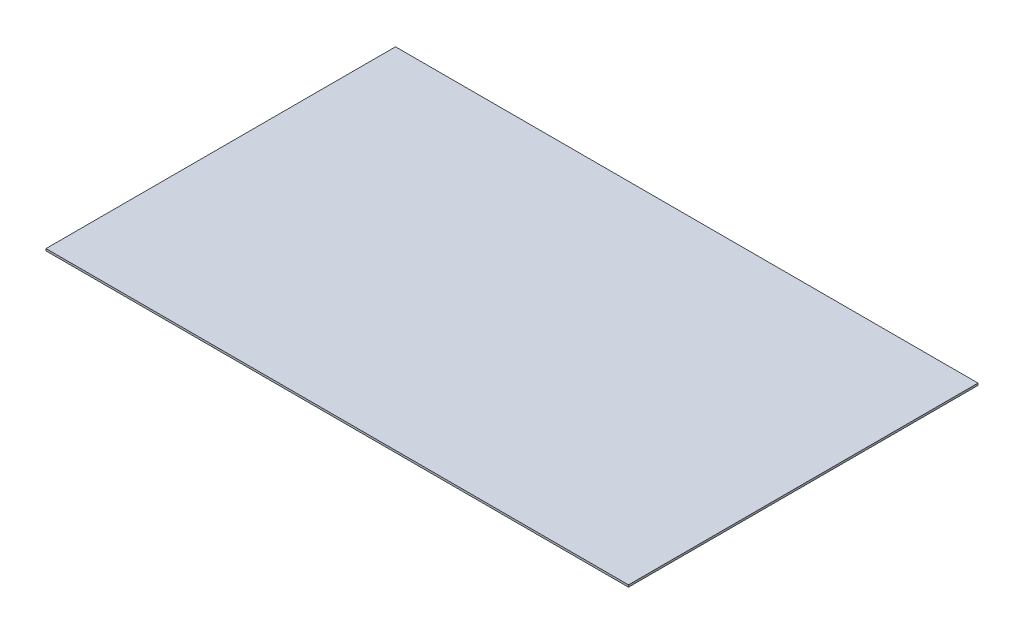
ISO-10303-21;
HEADER;
FILE_DESCRIPTION(('STEP AP214'),'2;1');
FILE_NAME('part.step','',(''),(''),'','','');
FILE_SCHEMA(('AUTOMOTIVE_DESIGN { 1 0 10303 214 1 1 1 1 }'));
ENDSEC;
DATA;
#1=APPLICATION_CONTEXT('core data for automotive mechanical design processes');
#2=APPLICATION_PROTOCOL_DEFINITION('international standard','automotive_design',2000,#1);
#3=PRODUCT_CONTEXT('',#1,'mechanical');
#4=PRODUCT('Part','Part','',(#3));
#5=PRODUCT_RELATED_PRODUCT_CATEGORY('part','',(#4));
#6=PRODUCT_DEFINITION_FORMATION('','',#4);
#7=PRODUCT_DEFINITION_CONTEXT('part definition',#1,'design');
#8=PRODUCT_DEFINITION('design','',#6,#7);
#9=PRODUCT_DEFINITION_SHAPE('','',#8);
#10=(LENGTH_UNIT() NAMED_UNIT(*) SI_UNIT(.MILLI.,.METRE.));
#11=(NAMED_UNIT(*) PLANE_ANGLE_UNIT() SI_UNIT($,.RADIAN.));
#12=(NAMED_UNIT(*) SI_UNIT($,.STERADIAN.) SOLID_ANGLE_UNIT());
#13=UNCERTAINTY_MEASURE_WITH_UNIT(LENGTH_MEASURE(1.E-05),#10,'distance_accuracy_value','');
#14=(GEOMETRIC_REPRESENTATION_CONTEXT(3) GLOBAL_UNCERTAINTY_ASSIGNED_CONTEXT((#13)) GLOBAL_UNIT_ASSIGNED_CONTEXT((#10,
#11,#12)) REPRESENTATION_CONTEXT('',''));
#15=CARTESIAN_POINT('',(0.,0.,0.));
#16=DIRECTION('',(0.,0.,1.));
#17=DIRECTION('',(1.,0.,0.));
#18=AXIS2_PLACEMENT_3D('',#15,#16,#17);
#19=CARTESIAN_POINT('',(0.,-0.889,0.));
#20=DIRECTION('',(-1.,0.,0.));
#21=DIRECTION('',(0.,0.,1.));
#22=AXIS2_PLACEMENT_3D('',#19,#20,#21);
#23=PLANE('',#22);
#24=DIRECTION('',(0.,0.,1.));
#25=VECTOR('',#24,1.);
#26=CARTESIAN_POINT('',(0.,0.,0.));
#27=LINE('',#26,#25);
#28=CARTESIAN_POINT('',(0.,0.,-152.4));
#29=VERTEX_POINT('',#28);
#30=CARTESIAN_POINT('',(0.,0.,0.));
#31=VERTEX_POINT('',#30);
#32=EDGE_CURVE('E97',#29,#31,#27,.T.);
#33=ORIENTED_EDGE('',*,*,#32,.F.);
#34=DIRECTION('',(0.,1.,0.));
#35=VECTOR('',#34,1.);
#36=CARTESIAN_POINT('',(0.,-0.889,-152.4));
#37=LINE('',#36,#35);
#38=CARTESIAN_POINT('',(0.,-0.889,-152.4));
#39=VERTEX_POINT('',#38);
#40=EDGE_CURVE('E11',#39,#29,#37,.T.);
#41=ORIENTED_EDGE('',*,*,#40,.F.);
#42=DIRECTION('',(0.,0.,1.));
#43=VECTOR('',#42,1.);
#44=CARTESIAN_POINT('',(0.,-0.889,0.));
#45=LINE('',#44,#43);
#46=CARTESIAN_POINT('',(0.,-0.889,0.));
#47=VERTEX_POINT('',#46);
#48=EDGE_CURVE('E91',#39,#47,#45,.T.);
#49=ORIENTED_EDGE('',*,*,#48,.T.);
#50=DIRECTION('',(0.,1.,0.));
#51=VECTOR('',#50,1.);
#52=CARTESIAN_POINT('',(0.,-0.889,0.));
#53=LINE('',#52,#51);
#54=EDGE_CURVE('E36',#47,#31,#53,.T.);
#55=ORIENTED_EDGE('',*,*,#54,.T.);
#56=EDGE_LOOP('',(#33,#41,#49,#55));
#57=FACE_BOUND('',#56,.T.);
#58=ADVANCED_FACE('F33',(#57),#23,.T.);
#59=CARTESIAN_POINT('',(0.,-0.889,-152.4));
#60=DIRECTION('',(0.,0.,-1.));
#61=DIRECTION('',(-1.,0.,0.));
#62=AXIS2_PLACEMENT_3D('',#59,#60,#61);
#63=PLANE('',#62);
#64=DIRECTION('',(-1.,0.,0.));
#65=VECTOR('',#64,1.);
#66=CARTESIAN_POINT('',(0.,0.,-152.4));
#67=LINE('',#66,#65);
#68=CARTESIAN_POINT('',(254.,0.,-152.4));
#69=VERTEX_POINT('',#68);
#70=EDGE_CURVE('E93',#69,#29,#67,.T.);
#71=ORIENTED_EDGE('',*,*,#70,.F.);
#72=DIRECTION('',(0.,1.,0.));
#73=VECTOR('',#72,1.);
#74=CARTESIAN_POINT('',(254.,-0.889,-152.4));
#75=LINE('',#74,#73);
#76=CARTESIAN_POINT('',(254.,-0.889,-152.4));
#77=VERTEX_POINT('',#76);
#78=EDGE_CURVE('E42',#77,#69,#75,.T.);
#79=ORIENTED_EDGE('',*,*,#78,.F.);
#80=DIRECTION('',(-1.,0.,0.));
#81=VECTOR('',#80,1.);
#82=CARTESIAN_POINT('',(0.,-0.889,-152.4));
#83=LINE('',#82,#81);
#84=EDGE_CURVE('E88',#77,#39,#83,.T.);
#85=ORIENTED_EDGE('',*,*,#84,.T.);
#86=ORIENTED_EDGE('',*,*,#40,.T.);
#87=EDGE_LOOP('',(#71,#79,#85,#86));
#88=FACE_BOUND('',#87,.T.);
#89=ADVANCED_FACE('F107',(#88),#63,.T.);
#90=CARTESIAN_POINT('',(254.,-0.889,0.));
#91=DIRECTION('',(1.,0.,0.));
#92=DIRECTION('',(0.,0.,-1.));
#93=AXIS2_PLACEMENT_3D('',#90,#91,#92);
#94=PLANE('',#93);
#95=DIRECTION('',(0.,0.,-1.));
#96=VECTOR('',#95,1.);
#97=CARTESIAN_POINT('',(254.,0.,0.));
#98=LINE('',#97,#96);
#99=CARTESIAN_POINT('',(254.,0.,0.));
#100=VERTEX_POINT('',#99);
#101=EDGE_CURVE('E83',#100,#69,#98,.T.);
#102=ORIENTED_EDGE('',*,*,#101,.F.);
#103=DIRECTION('',(0.,1.,0.));
#104=VECTOR('',#103,1.);
#105=CARTESIAN_POINT('',(254.,-0.889,0.));
#106=LINE('',#105,#104);
#107=CARTESIAN_POINT('',(254.,-0.889,0.));
#108=VERTEX_POINT('',#107);
#109=EDGE_CURVE('E78',#108,#100,#106,.T.);
#110=ORIENTED_EDGE('',*,*,#109,.F.);
#111=DIRECTION('',(0.,0.,-1.));
#112=VECTOR('',#111,1.);
#113=CARTESIAN_POINT('',(254.,-0.889,0.));
#114=LINE('',#113,#112);
#115=EDGE_CURVE('E81',#108,#77,#114,.T.);
#116=ORIENTED_EDGE('',*,*,#115,.T.);
#117=ORIENTED_EDGE('',*,*,#78,.T.);
#118=EDGE_LOOP('',(#102,#110,#116,#117));
#119=FACE_BOUND('',#118,.T.);
#120=ADVANCED_FACE('F80',(#119),#94,.T.);
#121=CARTESIAN_POINT('',(0.,-0.889,0.));
#122=DIRECTION('',(0.,0.,1.));
#123=DIRECTION('',(1.,0.,0.));
#124=AXIS2_PLACEMENT_3D('',#121,#122,#123);
#125=PLANE('',#124);
#126=DIRECTION('',(1.,0.,0.));
#127=VECTOR('',#126,1.);
#128=CARTESIAN_POINT('',(0.,0.,0.));
#129=LINE('',#128,#127);
#130=EDGE_CURVE('E100',#31,#100,#129,.T.);
#131=ORIENTED_EDGE('',*,*,#130,.F.);
#132=ORIENTED_EDGE('',*,*,#54,.F.);
#133=DIRECTION('',(1.,0.,0.));
#134=VECTOR('',#133,1.);
#135=CARTESIAN_POINT('',(0.,-0.889,0.));
#136=LINE('',#135,#134);
#137=EDGE_CURVE('E87',#47,#108,#136,.T.);
#138=ORIENTED_EDGE('',*,*,#137,.T.);
#139=ORIENTED_EDGE('',*,*,#109,.T.);
#140=EDGE_LOOP('',(#131,#132,#138,#139));
#141=FACE_BOUND('',#140,.T.);
#142=ADVANCED_FACE('F90',(#141),#125,.T.);
#143=CARTESIAN_POINT('',(0.,-0.889,-152.4));
#144=DIRECTION('',(0.,-1.,0.));
#145=DIRECTION('',(0.,0.,-1.));
#146=AXIS2_PLACEMENT_3D('',#143,#144,#145);
#147=PLANE('',#146);
#148=ORIENTED_EDGE('',*,*,#48,.F.);
#149=ORIENTED_EDGE('',*,*,#84,.F.);
#150=ORIENTED_EDGE('',*,*,#115,.F.);
#151=ORIENTED_EDGE('',*,*,#137,.F.);
#152=EDGE_LOOP('',(#148,#149,#150,#151));
#153=FACE_BOUND('',#152,.T.);
#154=ADVANCED_FACE('F86',(#153),#147,.T.);
#155=CARTESIAN_POINT('',(0.,0.,-152.4));
#156=DIRECTION('',(0.,-1.,0.));
#157=DIRECTION('',(0.,0.,-1.));
#158=AXIS2_PLACEMENT_3D('',#155,#156,#157);
#159=PLANE('',#158);
#160=ORIENTED_EDGE('',*,*,#32,.T.);
#161=ORIENTED_EDGE('',*,*,#130,.T.);
#162=ORIENTED_EDGE('',*,*,#101,.T.);
#163=ORIENTED_EDGE('',*,*,#70,.T.);
#164=EDGE_LOOP('',(#160,#161,#162,#163));
#165=FACE_BOUND('',#164,.T.);
#166=ADVANCED_FACE('F106',(#165),#159,.F.);
#167=CLOSED_SHELL('',(#58,#89,#120,#142,#154,#166));
#168=MANIFOLD_SOLID_BREP('B2',#167);
#169=ADVANCED_BREP_SHAPE_REPRESENTATION('',(#18,#168),#14);
#170=SHAPE_DEFINITION_REPRESENTATION(#9,#169);
ENDSEC;
END-ISO-10303-21;
